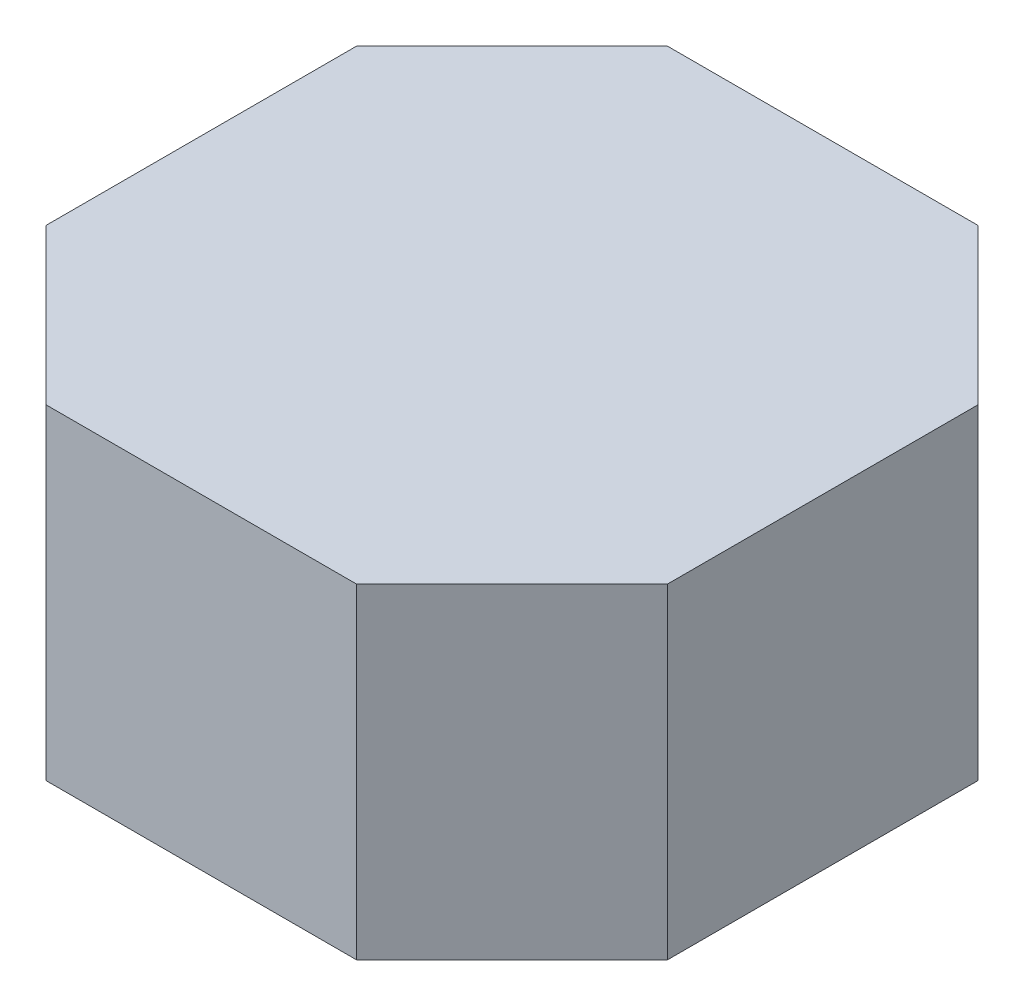
ISO-10303-21;
HEADER;
FILE_DESCRIPTION(('STEP AP214'),'2;1');
FILE_NAME('part.step','',(''),(''),'','','');
FILE_SCHEMA(('AUTOMOTIVE_DESIGN { 1 0 10303 214 1 1 1 1 }'));
ENDSEC;
DATA;
#1=APPLICATION_CONTEXT('core data for automotive mechanical design processes');
#2=APPLICATION_PROTOCOL_DEFINITION('international standard','automotive_design',2000,#1);
#3=PRODUCT_CONTEXT('',#1,'mechanical');
#4=PRODUCT('Part','Part','',(#3));
#5=PRODUCT_RELATED_PRODUCT_CATEGORY('part','',(#4));
#6=PRODUCT_DEFINITION_FORMATION('','',#4);
#7=PRODUCT_DEFINITION_CONTEXT('part definition',#1,'design');
#8=PRODUCT_DEFINITION('design','',#6,#7);
#9=PRODUCT_DEFINITION_SHAPE('','',#8);
#10=(LENGTH_UNIT() NAMED_UNIT(*) SI_UNIT(.MILLI.,.METRE.));
#11=(NAMED_UNIT(*) PLANE_ANGLE_UNIT() SI_UNIT($,.RADIAN.));
#12=(NAMED_UNIT(*) SI_UNIT($,.STERADIAN.) SOLID_ANGLE_UNIT());
#13=UNCERTAINTY_MEASURE_WITH_UNIT(LENGTH_MEASURE(1.E-05),#10,'distance_accuracy_value','');
#14=(GEOMETRIC_REPRESENTATION_CONTEXT(3) GLOBAL_UNCERTAINTY_ASSIGNED_CONTEXT((#13)) GLOBAL_UNIT_ASSIGNED_CONTEXT((#10,
#11,#12)) REPRESENTATION_CONTEXT('',''));
#15=CARTESIAN_POINT('',(0.,0.,0.));
#16=DIRECTION('',(0.,0.,1.));
#17=DIRECTION('',(1.,0.,0.));
#18=AXIS2_PLACEMENT_3D('',#15,#16,#17);
#19=CARTESIAN_POINT('',(21.,22.,-21.));
#20=DIRECTION('',(-1.,0.,0.));
#21=DIRECTION('',(0.,0.,1.));
#22=AXIS2_PLACEMENT_3D('',#19,#20,#21);
#23=PLANE('',#22);
#24=DIRECTION('',(0.,0.,-1.));
#25=VECTOR('',#24,1.);
#26=CARTESIAN_POINT('',(21.,0.,-21.));
#27=LINE('',#26,#25);
#28=CARTESIAN_POINT('',(21.,0.,10.5));
#29=VERTEX_POINT('',#28);
#30=CARTESIAN_POINT('',(21.,0.,-10.5));
#31=VERTEX_POINT('',#30);
#32=EDGE_CURVE('E131',#29,#31,#27,.T.);
#33=ORIENTED_EDGE('',*,*,#32,.T.);
#34=DIRECTION('',(0.,1.,0.));
#35=VECTOR('',#34,1.);
#36=CARTESIAN_POINT('',(21.,22.,-10.5));
#37=LINE('',#36,#35);
#38=CARTESIAN_POINT('',(21.,22.,-10.5));
#39=VERTEX_POINT('',#38);
#40=EDGE_CURVE('E154',#31,#39,#37,.T.);
#41=ORIENTED_EDGE('',*,*,#40,.T.);
#42=DIRECTION('',(0.,0.,-1.));
#43=VECTOR('',#42,1.);
#44=CARTESIAN_POINT('',(21.,22.,-21.));
#45=LINE('',#44,#43);
#46=CARTESIAN_POINT('',(21.,22.,10.5));
#47=VERTEX_POINT('',#46);
#48=EDGE_CURVE('E129',#47,#39,#45,.T.);
#49=ORIENTED_EDGE('',*,*,#48,.F.);
#50=DIRECTION('',(0.,-1.,0.));
#51=VECTOR('',#50,1.);
#52=CARTESIAN_POINT('',(21.,22.,10.5));
#53=LINE('',#52,#51);
#54=EDGE_CURVE('E151',#47,#29,#53,.T.);
#55=ORIENTED_EDGE('',*,*,#54,.T.);
#56=EDGE_LOOP('',(#33,#41,#49,#55));
#57=FACE_BOUND('',#56,.T.);
#58=ADVANCED_FACE('F36',(#57),#23,.F.);
#59=CARTESIAN_POINT('',(-21.,22.,-21.));
#60=DIRECTION('',(0.,0.,1.));
#61=DIRECTION('',(1.,0.,0.));
#62=AXIS2_PLACEMENT_3D('',#59,#60,#61);
#63=PLANE('',#62);
#64=DIRECTION('',(-1.,0.,0.));
#65=VECTOR('',#64,1.);
#66=CARTESIAN_POINT('',(-21.,0.,-21.));
#67=LINE('',#66,#65);
#68=CARTESIAN_POINT('',(10.5,0.,-21.));
#69=VERTEX_POINT('',#68);
#70=CARTESIAN_POINT('',(-10.5,0.,-21.));
#71=VERTEX_POINT('',#70);
#72=EDGE_CURVE('E127',#69,#71,#67,.T.);
#73=ORIENTED_EDGE('',*,*,#72,.T.);
#74=DIRECTION('',(0.,1.,0.));
#75=VECTOR('',#74,1.);
#76=CARTESIAN_POINT('',(-10.5,22.,-21.));
#77=LINE('',#76,#75);
#78=CARTESIAN_POINT('',(-10.5,22.,-21.));
#79=VERTEX_POINT('',#78);
#80=EDGE_CURVE('E106',#71,#79,#77,.T.);
#81=ORIENTED_EDGE('',*,*,#80,.T.);
#82=DIRECTION('',(-1.,0.,0.));
#83=VECTOR('',#82,1.);
#84=CARTESIAN_POINT('',(-21.,22.,-21.));
#85=LINE('',#84,#83);
#86=CARTESIAN_POINT('',(10.5,22.,-21.));
#87=VERTEX_POINT('',#86);
#88=EDGE_CURVE('E170',#87,#79,#85,.T.);
#89=ORIENTED_EDGE('',*,*,#88,.F.);
#90=DIRECTION('',(0.,-1.,0.));
#91=VECTOR('',#90,1.);
#92=CARTESIAN_POINT('',(10.5,22.,-21.));
#93=LINE('',#92,#91);
#94=EDGE_CURVE('E111',#87,#69,#93,.T.);
#95=ORIENTED_EDGE('',*,*,#94,.T.);
#96=EDGE_LOOP('',(#73,#81,#89,#95));
#97=FACE_BOUND('',#96,.T.);
#98=ADVANCED_FACE('F187',(#97),#63,.F.);
#99=CARTESIAN_POINT('',(-21.,22.,-21.));
#100=DIRECTION('',(1.,0.,0.));
#101=DIRECTION('',(0.,0.,-1.));
#102=AXIS2_PLACEMENT_3D('',#99,#100,#101);
#103=PLANE('',#102);
#104=DIRECTION('',(0.,0.,1.));
#105=VECTOR('',#104,1.);
#106=CARTESIAN_POINT('',(-21.,22.,-21.));
#107=LINE('',#106,#105);
#108=CARTESIAN_POINT('',(-21.,22.,-10.5));
#109=VERTEX_POINT('',#108);
#110=CARTESIAN_POINT('',(-21.,22.,10.5));
#111=VERTEX_POINT('',#110);
#112=EDGE_CURVE('E120',#109,#111,#107,.T.);
#113=ORIENTED_EDGE('',*,*,#112,.F.);
#114=DIRECTION('',(0.,-1.,0.));
#115=VECTOR('',#114,1.);
#116=CARTESIAN_POINT('',(-21.,22.,-10.5));
#117=LINE('',#116,#115);
#118=CARTESIAN_POINT('',(-21.,0.,-10.5));
#119=VERTEX_POINT('',#118);
#120=EDGE_CURVE('E105',#109,#119,#117,.T.);
#121=ORIENTED_EDGE('',*,*,#120,.T.);
#122=DIRECTION('',(0.,0.,1.));
#123=VECTOR('',#122,1.);
#124=CARTESIAN_POINT('',(-21.,0.,-21.));
#125=LINE('',#124,#123);
#126=CARTESIAN_POINT('',(-21.,0.,10.5));
#127=VERTEX_POINT('',#126);
#128=EDGE_CURVE('E118',#119,#127,#125,.T.);
#129=ORIENTED_EDGE('',*,*,#128,.T.);
#130=DIRECTION('',(0.,1.,0.));
#131=VECTOR('',#130,1.);
#132=CARTESIAN_POINT('',(-21.,22.,10.5));
#133=LINE('',#132,#131);
#134=EDGE_CURVE('E122',#127,#111,#133,.T.);
#135=ORIENTED_EDGE('',*,*,#134,.T.);
#136=EDGE_LOOP('',(#113,#121,#129,#135));
#137=FACE_BOUND('',#136,.T.);
#138=ADVANCED_FACE('F117',(#137),#103,.F.);
#139=CARTESIAN_POINT('',(-21.,22.,21.));
#140=DIRECTION('',(0.,0.,-1.));
#141=DIRECTION('',(-1.,0.,0.));
#142=AXIS2_PLACEMENT_3D('',#139,#140,#141);
#143=PLANE('',#142);
#144=DIRECTION('',(1.,0.,0.));
#145=VECTOR('',#144,1.);
#146=CARTESIAN_POINT('',(-21.,0.,21.));
#147=LINE('',#146,#145);
#148=CARTESIAN_POINT('',(-10.5,0.,21.));
#149=VERTEX_POINT('',#148);
#150=CARTESIAN_POINT('',(10.5,0.,21.));
#151=VERTEX_POINT('',#150);
#152=EDGE_CURVE('E126',#149,#151,#147,.T.);
#153=ORIENTED_EDGE('',*,*,#152,.T.);
#154=DIRECTION('',(0.,1.,0.));
#155=VECTOR('',#154,1.);
#156=CARTESIAN_POINT('',(10.5,22.,21.));
#157=LINE('',#156,#155);
#158=CARTESIAN_POINT('',(10.5,22.,21.));
#159=VERTEX_POINT('',#158);
#160=EDGE_CURVE('E11',#151,#159,#157,.T.);
#161=ORIENTED_EDGE('',*,*,#160,.T.);
#162=DIRECTION('',(1.,0.,0.));
#163=VECTOR('',#162,1.);
#164=CARTESIAN_POINT('',(-21.,22.,21.));
#165=LINE('',#164,#163);
#166=CARTESIAN_POINT('',(-10.5,22.,21.));
#167=VERTEX_POINT('',#166);
#168=EDGE_CURVE('E135',#167,#159,#165,.T.);
#169=ORIENTED_EDGE('',*,*,#168,.F.);
#170=DIRECTION('',(0.,-1.,0.));
#171=VECTOR('',#170,1.);
#172=CARTESIAN_POINT('',(-10.5,22.,21.));
#173=LINE('',#172,#171);
#174=EDGE_CURVE('E44',#167,#149,#173,.T.);
#175=ORIENTED_EDGE('',*,*,#174,.T.);
#176=EDGE_LOOP('',(#153,#161,#169,#175));
#177=FACE_BOUND('',#176,.T.);
#178=ADVANCED_FACE('F157',(#177),#143,.F.);
#179=CARTESIAN_POINT('',(0.,22.,0.));
#180=DIRECTION('',(0.,1.,0.));
#181=DIRECTION('',(0.,0.,1.));
#182=AXIS2_PLACEMENT_3D('',#179,#180,#181);
#183=PLANE('',#182);
#184=ORIENTED_EDGE('',*,*,#88,.T.);
#185=DIRECTION('',(0.707106781186549,0.,-0.707106781186546));
#186=VECTOR('',#185,1.);
#187=CARTESIAN_POINT('',(-15.75,22.,-15.75));
#188=LINE('',#187,#186);
#189=EDGE_CURVE('E149',#79,#109,#188,.F.);
#190=ORIENTED_EDGE('',*,*,#189,.T.);
#191=ORIENTED_EDGE('',*,*,#112,.T.);
#192=DIRECTION('',(-0.707106781186546,0.,-0.707106781186549));
#193=VECTOR('',#192,1.);
#194=CARTESIAN_POINT('',(-15.75,22.,15.75));
#195=LINE('',#194,#193);
#196=EDGE_CURVE('E56',#111,#167,#195,.F.);
#197=ORIENTED_EDGE('',*,*,#196,.T.);
#198=ORIENTED_EDGE('',*,*,#168,.T.);
#199=DIRECTION('',(-0.707106781186549,0.,0.707106781186546));
#200=VECTOR('',#199,1.);
#201=CARTESIAN_POINT('',(15.75,22.,15.75));
#202=LINE('',#201,#200);
#203=EDGE_CURVE('E145',#159,#47,#202,.F.);
#204=ORIENTED_EDGE('',*,*,#203,.T.);
#205=ORIENTED_EDGE('',*,*,#48,.T.);
#206=DIRECTION('',(0.707106781186547,0.,0.707106781186548));
#207=VECTOR('',#206,1.);
#208=CARTESIAN_POINT('',(15.75,22.,-15.75));
#209=LINE('',#208,#207);
#210=EDGE_CURVE('E147',#39,#87,#209,.F.);
#211=ORIENTED_EDGE('',*,*,#210,.T.);
#212=EDGE_LOOP('',(#184,#190,#191,#197,#198,#204,#205,#211));
#213=FACE_BOUND('',#212,.T.);
#214=ADVANCED_FACE('F176',(#213),#183,.T.);
#215=CARTESIAN_POINT('',(0.,0.,0.));
#216=DIRECTION('',(0.,1.,0.));
#217=DIRECTION('',(0.,0.,1.));
#218=AXIS2_PLACEMENT_3D('',#215,#216,#217);
#219=PLANE('',#218);
#220=ORIENTED_EDGE('',*,*,#128,.F.);
#221=DIRECTION('',(-0.707106781186549,0.,0.707106781186546));
#222=VECTOR('',#221,1.);
#223=CARTESIAN_POINT('',(-21.,0.,-10.5));
#224=LINE('',#223,#222);
#225=EDGE_CURVE('E101',#119,#71,#224,.F.);
#226=ORIENTED_EDGE('',*,*,#225,.T.);
#227=ORIENTED_EDGE('',*,*,#72,.F.);
#228=DIRECTION('',(-0.707106781186547,0.,-0.707106781186548));
#229=VECTOR('',#228,1.);
#230=CARTESIAN_POINT('',(10.5,0.,-21.));
#231=LINE('',#230,#229);
#232=EDGE_CURVE('E112',#69,#31,#231,.F.);
#233=ORIENTED_EDGE('',*,*,#232,.T.);
#234=ORIENTED_EDGE('',*,*,#32,.F.);
#235=DIRECTION('',(0.707106781186549,0.,-0.707106781186546));
#236=VECTOR('',#235,1.);
#237=CARTESIAN_POINT('',(21.,0.,10.5));
#238=LINE('',#237,#236);
#239=EDGE_CURVE('E138',#29,#151,#238,.F.);
#240=ORIENTED_EDGE('',*,*,#239,.T.);
#241=ORIENTED_EDGE('',*,*,#152,.F.);
#242=DIRECTION('',(0.707106781186546,0.,0.707106781186549));
#243=VECTOR('',#242,1.);
#244=CARTESIAN_POINT('',(-10.5,0.,21.));
#245=LINE('',#244,#243);
#246=EDGE_CURVE('E121',#149,#127,#245,.F.);
#247=ORIENTED_EDGE('',*,*,#246,.T.);
#248=EDGE_LOOP('',(#220,#226,#227,#233,#234,#240,#241,#247));
#249=FACE_BOUND('',#248,.T.);
#250=ADVANCED_FACE('F124',(#249),#219,.F.);
#251=CARTESIAN_POINT('',(-21.,22.,-10.5));
#252=DIRECTION('',(0.707106781186546,0.,0.707106781186549));
#253=DIRECTION('',(0.,-1.,0.));
#254=AXIS2_PLACEMENT_3D('',#251,#252,#253);
#255=PLANE('',#254);
#256=ORIENTED_EDGE('',*,*,#189,.F.);
#257=ORIENTED_EDGE('',*,*,#80,.F.);
#258=ORIENTED_EDGE('',*,*,#225,.F.);
#259=ORIENTED_EDGE('',*,*,#120,.F.);
#260=EDGE_LOOP('',(#256,#257,#258,#259));
#261=FACE_BOUND('',#260,.T.);
#262=ADVANCED_FACE('F104',(#261),#255,.F.);
#263=CARTESIAN_POINT('',(10.5,22.,-21.));
#264=DIRECTION('',(-0.707106781186548,0.,0.707106781186547));
#265=DIRECTION('',(0.,-1.,0.));
#266=AXIS2_PLACEMENT_3D('',#263,#264,#265);
#267=PLANE('',#266);
#268=ORIENTED_EDGE('',*,*,#210,.F.);
#269=ORIENTED_EDGE('',*,*,#40,.F.);
#270=ORIENTED_EDGE('',*,*,#232,.F.);
#271=ORIENTED_EDGE('',*,*,#94,.F.);
#272=EDGE_LOOP('',(#268,#269,#270,#271));
#273=FACE_BOUND('',#272,.T.);
#274=ADVANCED_FACE('F198',(#273),#267,.F.);
#275=CARTESIAN_POINT('',(21.,22.,10.5));
#276=DIRECTION('',(-0.707106781186546,0.,-0.707106781186549));
#277=DIRECTION('',(0.,-1.,0.));
#278=AXIS2_PLACEMENT_3D('',#275,#276,#277);
#279=PLANE('',#278);
#280=ORIENTED_EDGE('',*,*,#203,.F.);
#281=ORIENTED_EDGE('',*,*,#160,.F.);
#282=ORIENTED_EDGE('',*,*,#239,.F.);
#283=ORIENTED_EDGE('',*,*,#54,.F.);
#284=EDGE_LOOP('',(#280,#281,#282,#283));
#285=FACE_BOUND('',#284,.T.);
#286=ADVANCED_FACE('F164',(#285),#279,.F.);
#287=CARTESIAN_POINT('',(-10.5,22.,21.));
#288=DIRECTION('',(0.707106781186549,0.,-0.707106781186546));
#289=DIRECTION('',(0.,-1.,0.));
#290=AXIS2_PLACEMENT_3D('',#287,#288,#289);
#291=PLANE('',#290);
#292=ORIENTED_EDGE('',*,*,#196,.F.);
#293=ORIENTED_EDGE('',*,*,#134,.F.);
#294=ORIENTED_EDGE('',*,*,#246,.F.);
#295=ORIENTED_EDGE('',*,*,#174,.F.);
#296=EDGE_LOOP('',(#292,#293,#294,#295));
#297=FACE_BOUND('',#296,.T.);
#298=ADVANCED_FACE('F38',(#297),#291,.F.);
#299=CLOSED_SHELL('',(#58,#98,#138,#178,#214,#250,#262,#274,#286,#298));
#300=MANIFOLD_SOLID_BREP('B2',#299);
#301=ADVANCED_BREP_SHAPE_REPRESENTATION('',(#18,#300),#14);
#302=SHAPE_DEFINITION_REPRESENTATION(#9,#301);
ENDSEC;
END-ISO-10303-21;
